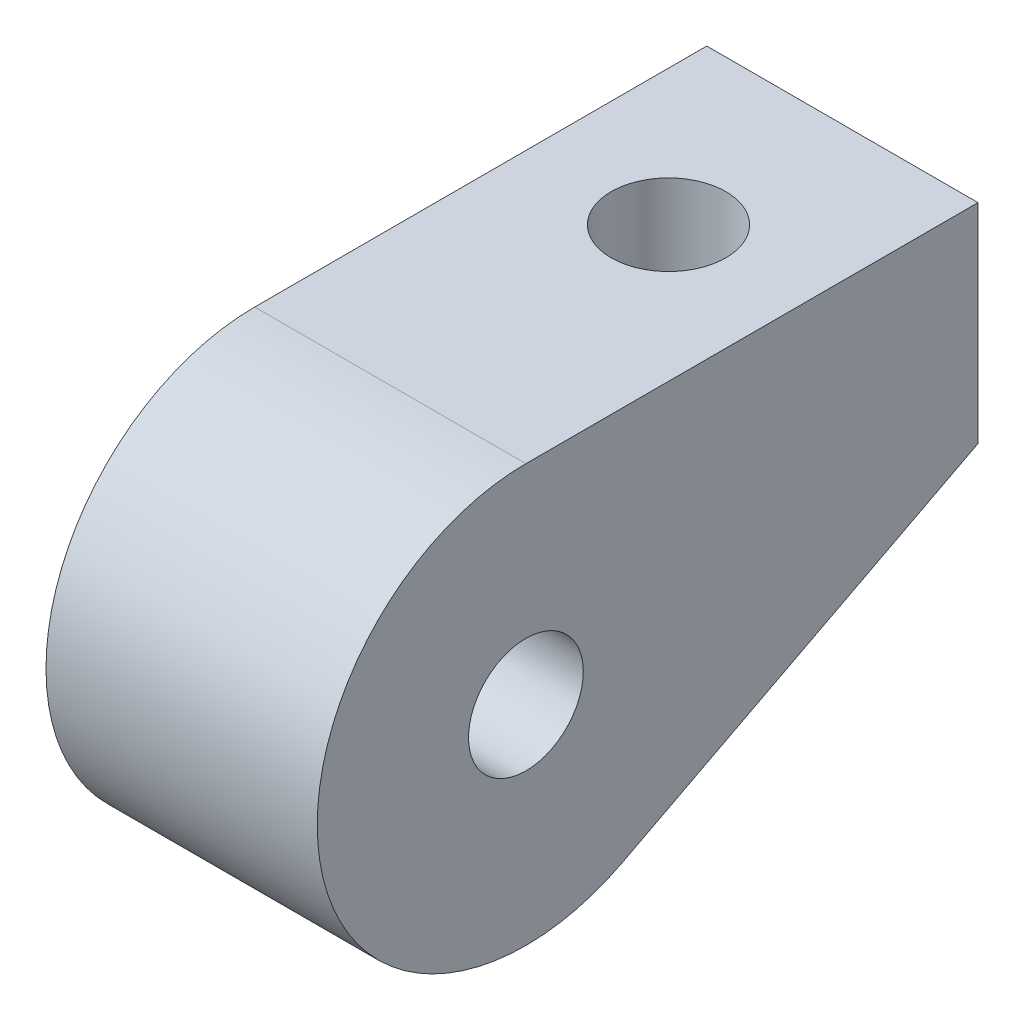
ISO-10303-21;
HEADER;
FILE_DESCRIPTION(('STEP AP214'),'2;1');
FILE_NAME('part.step','',(''),(''),'','','');
FILE_SCHEMA(('AUTOMOTIVE_DESIGN { 1 0 10303 214 1 1 1 1 }'));
ENDSEC;
DATA;
#1=APPLICATION_CONTEXT('core data for automotive mechanical design processes');
#2=APPLICATION_PROTOCOL_DEFINITION('international standard','automotive_design',2000,#1);
#3=PRODUCT_CONTEXT('',#1,'mechanical');
#4=PRODUCT('Part','Part','',(#3));
#5=PRODUCT_RELATED_PRODUCT_CATEGORY('part','',(#4));
#6=PRODUCT_DEFINITION_FORMATION('','',#4);
#7=PRODUCT_DEFINITION_CONTEXT('part definition',#1,'design');
#8=PRODUCT_DEFINITION('design','',#6,#7);
#9=PRODUCT_DEFINITION_SHAPE('','',#8);
#10=(LENGTH_UNIT() NAMED_UNIT(*) SI_UNIT(.MILLI.,.METRE.));
#11=(NAMED_UNIT(*) PLANE_ANGLE_UNIT() SI_UNIT($,.RADIAN.));
#12=(NAMED_UNIT(*) SI_UNIT($,.STERADIAN.) SOLID_ANGLE_UNIT());
#13=UNCERTAINTY_MEASURE_WITH_UNIT(LENGTH_MEASURE(1.E-05),#10,'distance_accuracy_value','');
#14=(GEOMETRIC_REPRESENTATION_CONTEXT(3) GLOBAL_UNCERTAINTY_ASSIGNED_CONTEXT((#13)) GLOBAL_UNIT_ASSIGNED_CONTEXT((#10,
#11,#12)) REPRESENTATION_CONTEXT('',''));
#15=CARTESIAN_POINT('',(0.,0.,0.));
#16=DIRECTION('',(0.,0.,1.));
#17=DIRECTION('',(1.,0.,0.));
#18=AXIS2_PLACEMENT_3D('',#15,#16,#17);
#19=CARTESIAN_POINT('',(3.9,-5.32272119754037,-2.76923076923077));
#20=DIRECTION('',(0.,0.887120199590061,0.461538461538462));
#21=DIRECTION('',(0.,-0.461538461538462,0.887120199590061));
#22=AXIS2_PLACEMENT_3D('',#19,#20,#21);
#23=PLANE('',#22);
#24=DIRECTION('',(0.,0.461538461538462,-0.887120199590061));
#25=VECTOR('',#24,1.);
#26=CARTESIAN_POINT('',(-3.9,-5.32272119754037,-2.76923076923077));
#27=LINE('',#26,#25);
#28=CARTESIAN_POINT('',(-3.9,-5.32272119754037,-2.76923076923077));
#29=VERTEX_POINT('',#28);
#30=CARTESIAN_POINT('',(-3.9,0.,-13.));
#31=VERTEX_POINT('',#30);
#32=EDGE_CURVE('E161',#29,#31,#27,.T.);
#33=ORIENTED_EDGE('',*,*,#32,.T.);
#34=DIRECTION('',(-1.,0.,0.));
#35=VECTOR('',#34,1.);
#36=CARTESIAN_POINT('',(3.9,0.,-13.));
#37=LINE('',#36,#35);
#38=CARTESIAN_POINT('',(3.9,0.,-13.));
#39=VERTEX_POINT('',#38);
#40=EDGE_CURVE('E183',#39,#31,#37,.T.);
#41=ORIENTED_EDGE('',*,*,#40,.F.);
#42=DIRECTION('',(0.,0.461538461538462,-0.887120199590061));
#43=VECTOR('',#42,1.);
#44=CARTESIAN_POINT('',(3.9,-5.32272119754037,-2.76923076923077));
#45=LINE('',#44,#43);
#46=CARTESIAN_POINT('',(3.9,-5.32272119754037,-2.76923076923077));
#47=VERTEX_POINT('',#46);
#48=EDGE_CURVE('E162',#47,#39,#45,.T.);
#49=ORIENTED_EDGE('',*,*,#48,.F.);
#50=DIRECTION('',(-1.,0.,0.));
#51=VECTOR('',#50,1.);
#52=CARTESIAN_POINT('',(3.9,-5.32272119754037,-2.76923076923077));
#53=LINE('',#52,#51);
#54=EDGE_CURVE('E62',#47,#29,#53,.T.);
#55=ORIENTED_EDGE('',*,*,#54,.T.);
#56=EDGE_LOOP('',(#33,#41,#49,#55));
#57=FACE_BOUND('',#56,.T.);
#58=DIRECTION('',(0.838131725167586,0.251754407489007,-0.483895577141871));
#59=VECTOR('',#58,1.);
#60=CARTESIAN_POINT('',(-1.65668600223952,-1.38208039412675,-10.3435118906443));
#61=LINE('',#60,#59);
#62=CARTESIAN_POINT('',(-2.85788383248865,-1.74289103874348,-9.65));
#63=VERTEX_POINT('',#62);
#64=CARTESIAN_POINT('',(0.,-0.884452168914602,-11.3));
#65=VERTEX_POINT('',#64);
#66=EDGE_CURVE('E11',#63,#65,#61,.T.);
#67=ORIENTED_EDGE('',*,*,#66,.F.);
#68=DIRECTION('',(0.,0.461538461538462,-0.887120199590061));
#69=VECTOR('',#68,1.);
#70=CARTESIAN_POINT('',(-2.85788383248865,-5.32272119754037,-2.76923076923077));
#71=LINE('',#70,#69);
#72=CARTESIAN_POINT('',(-2.85788383248865,-3.45976877840124,-6.35));
#73=VERTEX_POINT('',#72);
#74=EDGE_CURVE('E193',#73,#63,#71,.T.);
#75=ORIENTED_EDGE('',*,*,#74,.F.);
#76=DIRECTION('',(-0.838131725167586,0.251754407489007,-0.483895577141871));
#77=VECTOR('',#76,1.);
#78=CARTESIAN_POINT('',(3.73462707484106,-5.4399988872278,-2.54381205301765));
#79=LINE('',#78,#77);
#80=CARTESIAN_POINT('',(0.,-4.31820764823012,-4.7));
#81=VERTEX_POINT('',#80);
#82=EDGE_CURVE('E200',#81,#73,#79,.T.);
#83=ORIENTED_EDGE('',*,*,#82,.F.);
#84=DIRECTION('',(-0.838131725167586,-0.251754407489007,0.483895577141872));
#85=VECTOR('',#84,1.);
#86=CARTESIAN_POINT('',(1.74459827727161,-3.79417271146283,-5.70724428501052));
#87=LINE('',#86,#85);
#88=CARTESIAN_POINT('',(2.85788383248865,-3.45976877840124,-6.35));
#89=VERTEX_POINT('',#88);
#90=EDGE_CURVE('E202',#89,#81,#87,.T.);
#91=ORIENTED_EDGE('',*,*,#90,.F.);
#92=DIRECTION('',(0.,-0.461538461538462,0.887120199590061));
#93=VECTOR('',#92,1.);
#94=CARTESIAN_POINT('',(2.85788383248865,-5.32272119754037,-2.76923076923077));
#95=LINE('',#94,#93);
#96=CARTESIAN_POINT('',(2.85788383248865,-1.74289103874348,-9.65));
#97=VERTEX_POINT('',#96);
#98=EDGE_CURVE('E204',#97,#89,#95,.T.);
#99=ORIENTED_EDGE('',*,*,#98,.F.);
#100=DIRECTION('',(0.838131725167587,-0.251754407489006,0.483895577141871));
#101=VECTOR('',#100,1.);
#102=CARTESIAN_POINT('',(7.1359113543522,-3.02790656989172,-7.18007965865146));
#103=LINE('',#102,#101);
#104=EDGE_CURVE('E47',#65,#97,#103,.T.);
#105=ORIENTED_EDGE('',*,*,#104,.F.);
#106=EDGE_LOOP('',(#67,#75,#83,#91,#99,#105));
#107=FACE_BOUND('',#106,.T.);
#108=ADVANCED_FACE('F39',(#57,#107),#23,.F.);
#109=CARTESIAN_POINT('',(0.,-6.,-8.));
#110=DIRECTION('',(0.,1.,0.));
#111=DIRECTION('',(0.,0.,1.));
#112=AXIS2_PLACEMENT_3D('',#109,#110,#111);
#113=CYLINDRICAL_SURFACE('',#112,1.65);
#114=CARTESIAN_POINT('',(0.,6.,-8.));
#115=DIRECTION('',(0.,1.,0.));
#116=DIRECTION('',(0.,0.,1.));
#117=AXIS2_PLACEMENT_3D('',#114,#115,#116);
#118=CIRCLE('',#117,1.65);
#119=CARTESIAN_POINT('',(0.,6.,-6.35));
#120=VERTEX_POINT('',#119);
#121=EDGE_CURVE('E158',#120,#120,#118,.T.);
#122=CARTESIAN_POINT('',(0.,2.,-8.));
#123=DIRECTION('',(0.,-1.,0.));
#124=DIRECTION('',(0.,0.,-1.));
#125=AXIS2_PLACEMENT_3D('',#122,#123,#124);
#126=CIRCLE('',#125,1.65);
#127=CARTESIAN_POINT('',(0.,2.,-6.35));
#128=VERTEX_POINT('',#127);
#129=EDGE_CURVE('E124',#128,#128,#126,.F.);
#130=CARTESIAN_POINT('',(0.,6.,-6.35));
#131=CARTESIAN_POINT('',(0.,5.95833333333333,-6.35));
#132=CARTESIAN_POINT('',(0.,5.91666666666667,-6.35));
#133=CARTESIAN_POINT('',(0.,5.83333333333333,-6.35));
#134=CARTESIAN_POINT('',(0.,5.79166666666667,-6.35));
#135=CARTESIAN_POINT('',(0.,5.70833333333333,-6.35));
#136=CARTESIAN_POINT('',(0.,5.66666666666667,-6.35));
#137=CARTESIAN_POINT('',(0.,5.58333333333333,-6.35));
#138=CARTESIAN_POINT('',(0.,5.54166666666667,-6.35));
#139=CARTESIAN_POINT('',(0.,5.45833333333333,-6.35));
#140=CARTESIAN_POINT('',(0.,5.41666666666667,-6.35));
#141=CARTESIAN_POINT('',(0.,5.33333333333333,-6.35));
#142=CARTESIAN_POINT('',(0.,5.29166666666667,-6.35));
#143=CARTESIAN_POINT('',(0.,5.20833333333333,-6.35));
#144=CARTESIAN_POINT('',(0.,5.16666666666667,-6.35));
#145=CARTESIAN_POINT('',(0.,5.08333333333333,-6.35));
#146=CARTESIAN_POINT('',(0.,5.04166666666667,-6.35));
#147=CARTESIAN_POINT('',(0.,4.95833333333333,-6.35));
#148=CARTESIAN_POINT('',(0.,4.91666666666667,-6.35));
#149=CARTESIAN_POINT('',(0.,4.83333333333333,-6.35));
#150=CARTESIAN_POINT('',(0.,4.79166666666667,-6.35));
#151=CARTESIAN_POINT('',(0.,4.70833333333333,-6.35));
#152=CARTESIAN_POINT('',(0.,4.66666666666667,-6.35));
#153=CARTESIAN_POINT('',(0.,4.58333333333333,-6.35));
#154=CARTESIAN_POINT('',(0.,4.54166666666667,-6.35));
#155=CARTESIAN_POINT('',(0.,4.45833333333333,-6.35));
#156=CARTESIAN_POINT('',(0.,4.41666666666667,-6.35));
#157=CARTESIAN_POINT('',(0.,4.33333333333333,-6.35));
#158=CARTESIAN_POINT('',(0.,4.29166666666667,-6.35));
#159=CARTESIAN_POINT('',(0.,4.20833333333333,-6.35));
#160=CARTESIAN_POINT('',(0.,4.16666666666667,-6.35));
#161=CARTESIAN_POINT('',(0.,4.08333333333333,-6.35));
#162=CARTESIAN_POINT('',(0.,4.04166666666667,-6.35));
#163=CARTESIAN_POINT('',(0.,3.95833333333333,-6.35));
#164=CARTESIAN_POINT('',(0.,3.91666666666667,-6.35));
#165=CARTESIAN_POINT('',(0.,3.83333333333333,-6.35));
#166=CARTESIAN_POINT('',(0.,3.79166666666667,-6.35));
#167=CARTESIAN_POINT('',(0.,3.70833333333333,-6.35));
#168=CARTESIAN_POINT('',(0.,3.66666666666667,-6.35));
#169=CARTESIAN_POINT('',(0.,3.58333333333333,-6.35));
#170=CARTESIAN_POINT('',(0.,3.54166666666667,-6.35));
#171=CARTESIAN_POINT('',(0.,3.45833333333333,-6.35));
#172=CARTESIAN_POINT('',(0.,3.41666666666667,-6.35));
#173=CARTESIAN_POINT('',(0.,3.33333333333333,-6.35));
#174=CARTESIAN_POINT('',(0.,3.29166666666667,-6.35));
#175=CARTESIAN_POINT('',(0.,3.20833333333334,-6.35));
#176=CARTESIAN_POINT('',(0.,3.16666666666667,-6.35));
#177=CARTESIAN_POINT('',(0.,3.08333333333334,-6.35));
#178=CARTESIAN_POINT('',(0.,3.04166666666667,-6.35));
#179=CARTESIAN_POINT('',(0.,2.95833333333333,-6.35));
#180=CARTESIAN_POINT('',(0.,2.91666666666667,-6.35));
#181=CARTESIAN_POINT('',(0.,2.83333333333333,-6.35));
#182=CARTESIAN_POINT('',(0.,2.79166666666667,-6.35));
#183=CARTESIAN_POINT('',(0.,2.70833333333334,-6.35));
#184=CARTESIAN_POINT('',(0.,2.66666666666667,-6.35));
#185=CARTESIAN_POINT('',(0.,2.58333333333334,-6.35));
#186=CARTESIAN_POINT('',(0.,2.54166666666667,-6.35));
#187=CARTESIAN_POINT('',(0.,2.45833333333334,-6.35));
#188=CARTESIAN_POINT('',(0.,2.41666666666667,-6.35));
#189=CARTESIAN_POINT('',(0.,2.33333333333334,-6.35));
#190=CARTESIAN_POINT('',(0.,2.29166666666667,-6.35));
#191=CARTESIAN_POINT('',(0.,2.20833333333334,-6.35));
#192=CARTESIAN_POINT('',(0.,2.16666666666667,-6.35));
#193=CARTESIAN_POINT('',(0.,2.08333333333334,-6.35));
#194=CARTESIAN_POINT('',(0.,2.04166666666667,-6.35));
#195=CARTESIAN_POINT('',(0.,2.,-6.35));
#196=B_SPLINE_CURVE_WITH_KNOTS('',3,(#130,#131,#132,#133,#134,#135,#136,#137,#138,#139,#140,
#141,#142,#143,#144,#145,#146,#147,#148,#149,#150,#151,#152,#153,#154,#155,#156,#157,#158,#159,
#160,#161,#162,#163,#164,#165,#166,#167,#168,#169,#170,#171,#172,#173,#174,#175,#176,#177,#178,
#179,#180,#181,#182,#183,#184,#185,#186,#187,#188,#189,#190,#191,#192,#193,#194,#195),
.UNSPECIFIED.,.F.,.F.,(4,2,2,2,2,2,2,2,2,2,2,2,2,2,2,2,2,2,2,2,2,2,2,2,2,2,2,2,2,2,2,2,4),(0.,
0.125,0.25,0.375,0.5,0.624999999999999,0.749999999999999,0.874999999999999,0.999999999999999,
1.125,1.25,1.375,1.5,1.625,1.75,1.875,2.,2.125,2.25,2.375,2.5,2.625,2.75,2.875,3.,3.125,3.25,
3.375,3.5,3.625,3.75,3.875,4.),.UNSPECIFIED.);
#197=EDGE_CURVE('BSEAM230',#120,#128,#196,.T.);
#198=ORIENTED_EDGE('',*,*,#121,.T.);
#199=ORIENTED_EDGE('',*,*,#129,.F.);
#200=ORIENTED_EDGE('',*,*,#197,.T.);
#201=ORIENTED_EDGE('',*,*,#197,.F.);
#202=EDGE_LOOP('',(#198,#200,#199,#201));
#203=FACE_BOUND('',#202,.T.);
#204=ADVANCED_FACE('F230',(#203),#113,.F.);
#205=CARTESIAN_POINT('',(3.9,0.,0.));
#206=DIRECTION('',(-1.,0.,0.));
#207=DIRECTION('',(0.,0.,1.));
#208=AXIS2_PLACEMENT_3D('',#205,#206,#207);
#209=CYLINDRICAL_SURFACE('',#208,6.);
#210=ORIENTED_EDGE('',*,*,#54,.F.);
#211=CARTESIAN_POINT('',(3.9,0.,0.));
#212=DIRECTION('',(1.,0.,0.));
#213=DIRECTION('',(0.,0.,-1.));
#214=AXIS2_PLACEMENT_3D('',#211,#212,#213);
#215=CIRCLE('',#214,6.);
#216=CARTESIAN_POINT('',(3.9,6.,0.));
#217=VERTEX_POINT('',#216);
#218=EDGE_CURVE('E190',#217,#47,#215,.T.);
#219=ORIENTED_EDGE('',*,*,#218,.F.);
#220=DIRECTION('',(-1.,0.,0.));
#221=VECTOR('',#220,1.);
#222=CARTESIAN_POINT('',(3.9,6.,0.));
#223=LINE('',#222,#221);
#224=CARTESIAN_POINT('',(-3.9,6.,0.));
#225=VERTEX_POINT('',#224);
#226=EDGE_CURVE('E171',#217,#225,#223,.T.);
#227=ORIENTED_EDGE('',*,*,#226,.T.);
#228=CARTESIAN_POINT('',(-3.9,0.,0.));
#229=DIRECTION('',(1.,0.,0.));
#230=DIRECTION('',(0.,0.,-1.));
#231=AXIS2_PLACEMENT_3D('',#228,#229,#230);
#232=CIRCLE('',#231,6.);
#233=EDGE_CURVE('E191',#225,#29,#232,.T.);
#234=ORIENTED_EDGE('',*,*,#233,.T.);
#235=EDGE_LOOP('',(#210,#219,#227,#234));
#236=FACE_BOUND('',#235,.T.);
#237=ADVANCED_FACE('F236',(#236),#209,.T.);
#238=CARTESIAN_POINT('',(3.9,0.,0.));
#239=DIRECTION('',(-1.,0.,0.));
#240=DIRECTION('',(0.,0.,1.));
#241=AXIS2_PLACEMENT_3D('',#238,#239,#240);
#242=CYLINDRICAL_SURFACE('',#241,1.65);
#243=CARTESIAN_POINT('',(3.9,0.,0.));
#244=DIRECTION('',(1.,0.,0.));
#245=DIRECTION('',(0.,0.,-1.));
#246=AXIS2_PLACEMENT_3D('',#243,#244,#245);
#247=CIRCLE('',#246,1.65);
#248=CARTESIAN_POINT('',(3.9,0.,-1.65));
#249=VERTEX_POINT('',#248);
#250=EDGE_CURVE('E187',#249,#249,#247,.T.);
#251=ORIENTED_EDGE('',*,*,#250,.T.);
#252=EDGE_LOOP('',(#251));
#253=FACE_BOUND('',#252,.T.);
#254=CARTESIAN_POINT('',(-3.9,0.,0.));
#255=DIRECTION('',(1.,0.,0.));
#256=DIRECTION('',(0.,0.,-1.));
#257=AXIS2_PLACEMENT_3D('',#254,#255,#256);
#258=CIRCLE('',#257,1.65);
#259=CARTESIAN_POINT('',(-3.9,0.,-1.65));
#260=VERTEX_POINT('',#259);
#261=EDGE_CURVE('E186',#260,#260,#258,.T.);
#262=ORIENTED_EDGE('',*,*,#261,.F.);
#263=EDGE_LOOP('',(#262));
#264=FACE_BOUND('',#263,.T.);
#265=ADVANCED_FACE('F41',(#253,#264),#242,.F.);
#266=CARTESIAN_POINT('',(3.9,0.,0.));
#267=DIRECTION('',(1.,0.,0.));
#268=DIRECTION('',(0.,0.,-1.));
#269=AXIS2_PLACEMENT_3D('',#266,#267,#268);
#270=PLANE('',#269);
#271=ORIENTED_EDGE('',*,*,#250,.F.);
#272=EDGE_LOOP('',(#271));
#273=FACE_BOUND('',#272,.T.);
#274=ORIENTED_EDGE('',*,*,#218,.T.);
#275=ORIENTED_EDGE('',*,*,#48,.T.);
#276=DIRECTION('',(0.,-1.,0.));
#277=VECTOR('',#276,1.);
#278=CARTESIAN_POINT('',(3.9,0.,-13.));
#279=LINE('',#278,#277);
#280=CARTESIAN_POINT('',(3.9,6.,-13.));
#281=VERTEX_POINT('',#280);
#282=EDGE_CURVE('E164',#281,#39,#279,.T.);
#283=ORIENTED_EDGE('',*,*,#282,.F.);
#284=DIRECTION('',(0.,0.,-1.));
#285=VECTOR('',#284,1.);
#286=CARTESIAN_POINT('',(3.9,6.,0.));
#287=LINE('',#286,#285);
#288=EDGE_CURVE('E168',#217,#281,#287,.T.);
#289=ORIENTED_EDGE('',*,*,#288,.F.);
#290=EDGE_LOOP('',(#274,#275,#283,#289));
#291=FACE_BOUND('',#290,.T.);
#292=ADVANCED_FACE('F243',(#273,#291),#270,.T.);
#293=CARTESIAN_POINT('',(-3.9,0.,0.));
#294=DIRECTION('',(1.,0.,0.));
#295=DIRECTION('',(0.,0.,-1.));
#296=AXIS2_PLACEMENT_3D('',#293,#294,#295);
#297=PLANE('',#296);
#298=ORIENTED_EDGE('',*,*,#261,.T.);
#299=EDGE_LOOP('',(#298));
#300=FACE_BOUND('',#299,.T.);
#301=ORIENTED_EDGE('',*,*,#233,.F.);
#302=DIRECTION('',(0.,0.,-1.));
#303=VECTOR('',#302,1.);
#304=CARTESIAN_POINT('',(-3.9,6.,0.));
#305=LINE('',#304,#303);
#306=CARTESIAN_POINT('',(-3.9,6.,-13.));
#307=VERTEX_POINT('',#306);
#308=EDGE_CURVE('E165',#225,#307,#305,.T.);
#309=ORIENTED_EDGE('',*,*,#308,.T.);
#310=DIRECTION('',(0.,-1.,0.));
#311=VECTOR('',#310,1.);
#312=CARTESIAN_POINT('',(-3.9,0.,-13.));
#313=LINE('',#312,#311);
#314=EDGE_CURVE('E174',#307,#31,#313,.T.);
#315=ORIENTED_EDGE('',*,*,#314,.T.);
#316=ORIENTED_EDGE('',*,*,#32,.F.);
#317=EDGE_LOOP('',(#301,#309,#315,#316));
#318=FACE_BOUND('',#317,.T.);
#319=ADVANCED_FACE('F246',(#300,#318),#297,.F.);
#320=CARTESIAN_POINT('',(3.9,0.,-13.));
#321=DIRECTION('',(0.,0.,-1.));
#322=DIRECTION('',(-1.,0.,0.));
#323=AXIS2_PLACEMENT_3D('',#320,#321,#322);
#324=PLANE('',#323);
#325=ORIENTED_EDGE('',*,*,#314,.F.);
#326=DIRECTION('',(-1.,0.,0.));
#327=VECTOR('',#326,1.);
#328=CARTESIAN_POINT('',(3.9,6.,-13.));
#329=LINE('',#328,#327);
#330=EDGE_CURVE('E181',#281,#307,#329,.T.);
#331=ORIENTED_EDGE('',*,*,#330,.F.);
#332=ORIENTED_EDGE('',*,*,#282,.T.);
#333=ORIENTED_EDGE('',*,*,#40,.T.);
#334=EDGE_LOOP('',(#325,#331,#332,#333));
#335=FACE_BOUND('',#334,.T.);
#336=ADVANCED_FACE('F241',(#335),#324,.T.);
#337=CARTESIAN_POINT('',(3.9,6.,0.));
#338=DIRECTION('',(0.,1.,0.));
#339=DIRECTION('',(0.,0.,1.));
#340=AXIS2_PLACEMENT_3D('',#337,#338,#339);
#341=PLANE('',#340);
#342=ORIENTED_EDGE('',*,*,#121,.F.);
#343=EDGE_LOOP('',(#342));
#344=FACE_BOUND('',#343,.T.);
#345=ORIENTED_EDGE('',*,*,#308,.F.);
#346=ORIENTED_EDGE('',*,*,#226,.F.);
#347=ORIENTED_EDGE('',*,*,#288,.T.);
#348=ORIENTED_EDGE('',*,*,#330,.T.);
#349=EDGE_LOOP('',(#345,#346,#347,#348));
#350=FACE_BOUND('',#349,.T.);
#351=ADVANCED_FACE('F266',(#344,#350),#341,.T.);
#352=CARTESIAN_POINT('',(-2.85788383248865,-6.,-9.65));
#353=DIRECTION('',(0.5,0.,0.866025403784439));
#354=DIRECTION('',(0.866025403784439,0.,-0.5));
#355=AXIS2_PLACEMENT_3D('',#352,#353,#354);
#356=PLANE('',#355);
#357=ORIENTED_EDGE('',*,*,#66,.T.);
#358=DIRECTION('',(0.,1.,0.));
#359=VECTOR('',#358,1.);
#360=CARTESIAN_POINT('',(0.,-6.,-11.3));
#361=LINE('',#360,#359);
#362=CARTESIAN_POINT('',(0.,2.,-11.3));
#363=VERTEX_POINT('',#362);
#364=EDGE_CURVE('E115',#65,#363,#361,.T.);
#365=ORIENTED_EDGE('',*,*,#364,.T.);
#366=DIRECTION('',(0.866025403784439,0.,-0.5));
#367=VECTOR('',#366,1.);
#368=CARTESIAN_POINT('',(-2.85788383248865,2.,-9.65));
#369=LINE('',#368,#367);
#370=CARTESIAN_POINT('',(-2.85788383248865,2.,-9.65));
#371=VERTEX_POINT('',#370);
#372=EDGE_CURVE('E120',#371,#363,#369,.T.);
#373=ORIENTED_EDGE('',*,*,#372,.F.);
#374=DIRECTION('',(0.,1.,0.));
#375=VECTOR('',#374,1.);
#376=CARTESIAN_POINT('',(-2.85788383248865,-6.,-9.65));
#377=LINE('',#376,#375);
#378=EDGE_CURVE('E150',#63,#371,#377,.T.);
#379=ORIENTED_EDGE('',*,*,#378,.F.);
#380=EDGE_LOOP('',(#357,#365,#373,#379));
#381=FACE_BOUND('',#380,.T.);
#382=ADVANCED_FACE('F117',(#381),#356,.T.);
#383=CARTESIAN_POINT('',(0.,-6.,-11.3));
#384=DIRECTION('',(-0.499999999999999,0.,0.866025403784439));
#385=DIRECTION('',(0.866025403784439,0.,0.499999999999999));
#386=AXIS2_PLACEMENT_3D('',#383,#384,#385);
#387=PLANE('',#386);
#388=ORIENTED_EDGE('',*,*,#104,.T.);
#389=DIRECTION('',(0.,1.,0.));
#390=VECTOR('',#389,1.);
#391=CARTESIAN_POINT('',(2.85788383248865,-6.,-9.65));
#392=LINE('',#391,#390);
#393=CARTESIAN_POINT('',(2.85788383248865,2.,-9.65));
#394=VERTEX_POINT('',#393);
#395=EDGE_CURVE('E125',#97,#394,#392,.T.);
#396=ORIENTED_EDGE('',*,*,#395,.T.);
#397=DIRECTION('',(0.866025403784439,0.,0.499999999999999));
#398=VECTOR('',#397,1.);
#399=CARTESIAN_POINT('',(0.,2.,-11.3));
#400=LINE('',#399,#398);
#401=EDGE_CURVE('E128',#363,#394,#400,.T.);
#402=ORIENTED_EDGE('',*,*,#401,.F.);
#403=ORIENTED_EDGE('',*,*,#364,.F.);
#404=EDGE_LOOP('',(#388,#396,#402,#403));
#405=FACE_BOUND('',#404,.T.);
#406=ADVANCED_FACE('F129',(#405),#387,.T.);
#407=CARTESIAN_POINT('',(2.85788383248865,-6.,-9.65));
#408=DIRECTION('',(-1.,0.,0.));
#409=DIRECTION('',(0.,0.,1.));
#410=AXIS2_PLACEMENT_3D('',#407,#408,#409);
#411=PLANE('',#410);
#412=ORIENTED_EDGE('',*,*,#98,.T.);
#413=DIRECTION('',(0.,1.,0.));
#414=VECTOR('',#413,1.);
#415=CARTESIAN_POINT('',(2.85788383248865,-6.,-6.35));
#416=LINE('',#415,#414);
#417=CARTESIAN_POINT('',(2.85788383248865,2.,-6.35));
#418=VERTEX_POINT('',#417);
#419=EDGE_CURVE('E155',#89,#418,#416,.T.);
#420=ORIENTED_EDGE('',*,*,#419,.T.);
#421=DIRECTION('',(0.,0.,1.));
#422=VECTOR('',#421,1.);
#423=CARTESIAN_POINT('',(2.85788383248865,2.,-9.65));
#424=LINE('',#423,#422);
#425=EDGE_CURVE('E134',#394,#418,#424,.T.);
#426=ORIENTED_EDGE('',*,*,#425,.F.);
#427=ORIENTED_EDGE('',*,*,#395,.F.);
#428=EDGE_LOOP('',(#412,#420,#426,#427));
#429=FACE_BOUND('',#428,.T.);
#430=ADVANCED_FACE('F208',(#429),#411,.T.);
#431=CARTESIAN_POINT('',(2.85788383248865,-6.,-6.35));
#432=DIRECTION('',(-0.5,0.,-0.866025403784438));
#433=DIRECTION('',(-0.866025403784439,0.,0.5));
#434=AXIS2_PLACEMENT_3D('',#431,#432,#433);
#435=PLANE('',#434);
#436=ORIENTED_EDGE('',*,*,#90,.T.);
#437=DIRECTION('',(0.,1.,0.));
#438=VECTOR('',#437,1.);
#439=CARTESIAN_POINT('',(0.,-6.,-4.7));
#440=LINE('',#439,#438);
#441=CARTESIAN_POINT('',(0.,2.,-4.7));
#442=VERTEX_POINT('',#441);
#443=EDGE_CURVE('E153',#81,#442,#440,.T.);
#444=ORIENTED_EDGE('',*,*,#443,.T.);
#445=DIRECTION('',(-0.866025403784438,0.,0.5));
#446=VECTOR('',#445,1.);
#447=CARTESIAN_POINT('',(2.85788383248865,2.,-6.35));
#448=LINE('',#447,#446);
#449=EDGE_CURVE('E144',#418,#442,#448,.T.);
#450=ORIENTED_EDGE('',*,*,#449,.F.);
#451=ORIENTED_EDGE('',*,*,#419,.F.);
#452=EDGE_LOOP('',(#436,#444,#450,#451));
#453=FACE_BOUND('',#452,.T.);
#454=ADVANCED_FACE('F215',(#453),#435,.T.);
#455=CARTESIAN_POINT('',(0.,-6.,-4.7));
#456=DIRECTION('',(0.5,0.,-0.866025403784439));
#457=DIRECTION('',(-0.866025403784439,0.,-0.5));
#458=AXIS2_PLACEMENT_3D('',#455,#456,#457);
#459=PLANE('',#458);
#460=ORIENTED_EDGE('',*,*,#82,.T.);
#461=DIRECTION('',(0.,1.,0.));
#462=VECTOR('',#461,1.);
#463=CARTESIAN_POINT('',(-2.85788383248865,-6.,-6.35));
#464=LINE('',#463,#462);
#465=CARTESIAN_POINT('',(-2.85788383248865,2.,-6.35));
#466=VERTEX_POINT('',#465);
#467=EDGE_CURVE('E54',#73,#466,#464,.T.);
#468=ORIENTED_EDGE('',*,*,#467,.T.);
#469=DIRECTION('',(-0.866025403784439,0.,-0.5));
#470=VECTOR('',#469,1.);
#471=CARTESIAN_POINT('',(0.,2.,-4.7));
#472=LINE('',#471,#470);
#473=EDGE_CURVE('E147',#442,#466,#472,.T.);
#474=ORIENTED_EDGE('',*,*,#473,.F.);
#475=ORIENTED_EDGE('',*,*,#443,.F.);
#476=EDGE_LOOP('',(#460,#468,#474,#475));
#477=FACE_BOUND('',#476,.T.);
#478=ADVANCED_FACE('F219',(#477),#459,.T.);
#479=CARTESIAN_POINT('',(-2.85788383248865,-6.,-6.35));
#480=DIRECTION('',(1.,0.,0.));
#481=DIRECTION('',(0.,0.,-1.));
#482=AXIS2_PLACEMENT_3D('',#479,#480,#481);
#483=PLANE('',#482);
#484=ORIENTED_EDGE('',*,*,#74,.T.);
#485=ORIENTED_EDGE('',*,*,#378,.T.);
#486=DIRECTION('',(0.,0.,-1.));
#487=VECTOR('',#486,1.);
#488=CARTESIAN_POINT('',(-2.85788383248865,2.,-6.35));
#489=LINE('',#488,#487);
#490=EDGE_CURVE('E140',#466,#371,#489,.T.);
#491=ORIENTED_EDGE('',*,*,#490,.F.);
#492=ORIENTED_EDGE('',*,*,#467,.F.);
#493=EDGE_LOOP('',(#484,#485,#491,#492));
#494=FACE_BOUND('',#493,.T.);
#495=ADVANCED_FACE('F220',(#494),#483,.T.);
#496=CARTESIAN_POINT('',(0.,2.,0.));
#497=DIRECTION('',(0.,-1.,0.));
#498=DIRECTION('',(0.,0.,-1.));
#499=AXIS2_PLACEMENT_3D('',#496,#497,#498);
#500=PLANE('',#499);
#501=ORIENTED_EDGE('',*,*,#372,.T.);
#502=ORIENTED_EDGE('',*,*,#401,.T.);
#503=ORIENTED_EDGE('',*,*,#425,.T.);
#504=ORIENTED_EDGE('',*,*,#449,.T.);
#505=ORIENTED_EDGE('',*,*,#473,.T.);
#506=ORIENTED_EDGE('',*,*,#490,.T.);
#507=EDGE_LOOP('',(#501,#502,#503,#504,#505,#506));
#508=FACE_BOUND('',#507,.T.);
#509=ORIENTED_EDGE('',*,*,#129,.T.);
#510=EDGE_LOOP('',(#509));
#511=FACE_BOUND('',#510,.T.);
#512=ADVANCED_FACE('F137',(#508,#511),#500,.T.);
#513=CLOSED_SHELL('',(#108,#204,#237,#265,#292,#319,#336,#351,#382,#406,#430,#454,#478,#495,#512));
#514=MANIFOLD_SOLID_BREP('B2',#513);
#515=ADVANCED_BREP_SHAPE_REPRESENTATION('',(#18,#514),#14);
#516=SHAPE_DEFINITION_REPRESENTATION(#9,#515);
ENDSEC;
END-ISO-10303-21;
